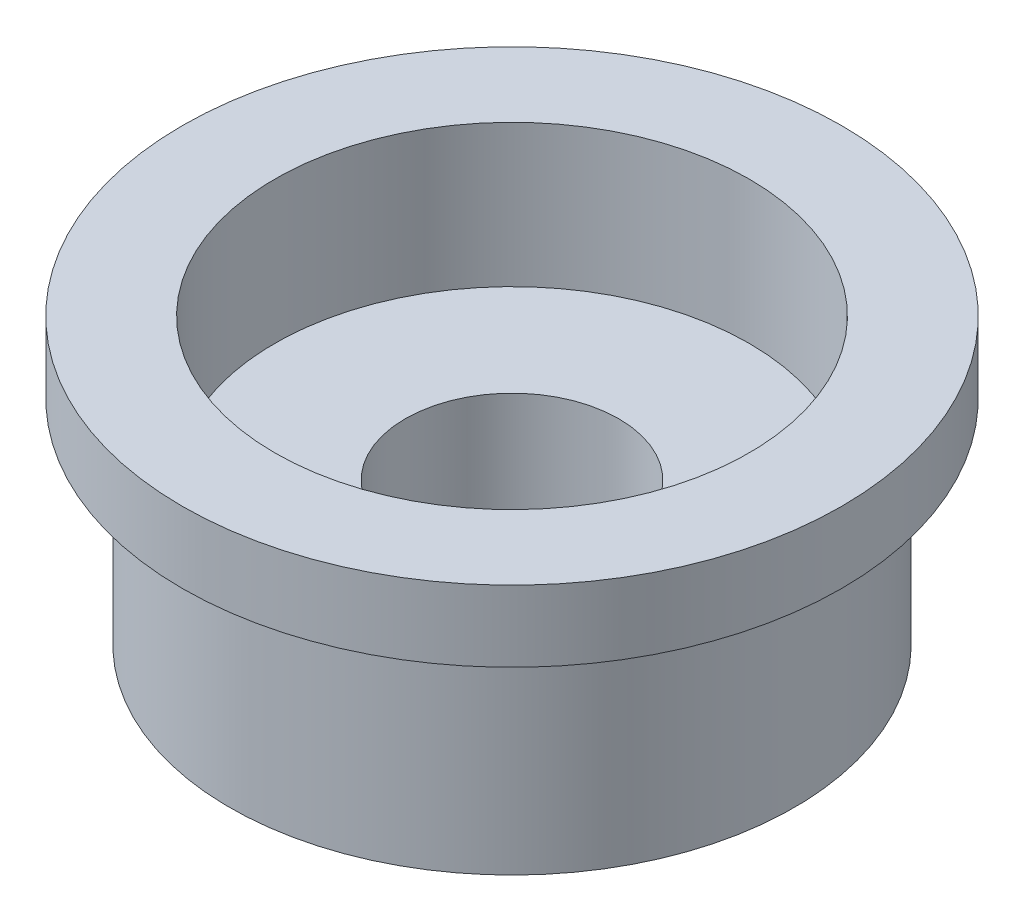
ISO-10303-21;
HEADER;
FILE_DESCRIPTION(('STEP AP214'),'2;1');
FILE_NAME('part.step','',(''),(''),'','','');
FILE_SCHEMA(('AUTOMOTIVE_DESIGN { 1 0 10303 214 1 1 1 1 }'));
ENDSEC;
DATA;
#1=APPLICATION_CONTEXT('core data for automotive mechanical design processes');
#2=APPLICATION_PROTOCOL_DEFINITION('international standard','automotive_design',2000,#1);
#3=PRODUCT_CONTEXT('',#1,'mechanical');
#4=PRODUCT('Part','Part','',(#3));
#5=PRODUCT_RELATED_PRODUCT_CATEGORY('part','',(#4));
#6=PRODUCT_DEFINITION_FORMATION('','',#4);
#7=PRODUCT_DEFINITION_CONTEXT('part definition',#1,'design');
#8=PRODUCT_DEFINITION('design','',#6,#7);
#9=PRODUCT_DEFINITION_SHAPE('','',#8);
#10=(LENGTH_UNIT() NAMED_UNIT(*) SI_UNIT(.MILLI.,.METRE.));
#11=(NAMED_UNIT(*) PLANE_ANGLE_UNIT() SI_UNIT($,.RADIAN.));
#12=(NAMED_UNIT(*) SI_UNIT($,.STERADIAN.) SOLID_ANGLE_UNIT());
#13=UNCERTAINTY_MEASURE_WITH_UNIT(LENGTH_MEASURE(1.E-05),#10,'distance_accuracy_value','');
#14=(GEOMETRIC_REPRESENTATION_CONTEXT(3) GLOBAL_UNCERTAINTY_ASSIGNED_CONTEXT((#13)) GLOBAL_UNIT_ASSIGNED_CONTEXT((#10,
#11,#12)) REPRESENTATION_CONTEXT('',''));
#15=CARTESIAN_POINT('',(0.,0.,0.));
#16=DIRECTION('',(0.,0.,1.));
#17=DIRECTION('',(1.,0.,0.));
#18=AXIS2_PLACEMENT_3D('',#15,#16,#17);
#19=CARTESIAN_POINT('',(0.,26.,0.));
#20=DIRECTION('',(0.,1.,0.));
#21=DIRECTION('',(-1.,0.,0.));
#22=AXIS2_PLACEMENT_3D('',#19,#20,#21);
#23=CYLINDRICAL_SURFACE('',#22,6.95);
#24=CARTESIAN_POINT('',(0.,26.,0.));
#25=DIRECTION('',(0.,1.,0.));
#26=DIRECTION('',(-1.,0.,0.));
#27=AXIS2_PLACEMENT_3D('',#24,#25,#26);
#28=CIRCLE('',#27,6.95);
#29=CARTESIAN_POINT('',(-6.95,26.,0.));
#30=VERTEX_POINT('',#29);
#31=EDGE_CURVE('E19',#30,#30,#28,.T.);
#32=ORIENTED_EDGE('',*,*,#31,.T.);
#33=EDGE_LOOP('',(#32));
#34=FACE_BOUND('',#33,.T.);
#35=CARTESIAN_POINT('',(0.,27.5,0.));
#36=DIRECTION('',(0.,1.,0.));
#37=DIRECTION('',(-1.,0.,0.));
#38=AXIS2_PLACEMENT_3D('',#35,#36,#37);
#39=CIRCLE('',#38,6.95);
#40=CARTESIAN_POINT('',(-6.95,27.5,0.));
#41=VERTEX_POINT('',#40);
#42=EDGE_CURVE('E41',#41,#41,#39,.F.);
#43=ORIENTED_EDGE('',*,*,#42,.T.);
#44=EDGE_LOOP('',(#43));
#45=FACE_BOUND('',#44,.T.);
#46=ADVANCED_FACE('F15',(#34,#45),#23,.T.);
#47=CARTESIAN_POINT('',(-7.228,26.,-7.228));
#48=DIRECTION('',(0.,1.,0.));
#49=DIRECTION('',(0.,0.,1.));
#50=AXIS2_PLACEMENT_3D('',#47,#48,#49);
#51=PLANE('',#50);
#52=CARTESIAN_POINT('',(0.,26.,0.));
#53=DIRECTION('',(0.,1.,0.));
#54=DIRECTION('',(-1.,0.,0.));
#55=AXIS2_PLACEMENT_3D('',#52,#53,#54);
#56=CIRCLE('',#55,5.95);
#57=CARTESIAN_POINT('',(-5.95,26.,0.));
#58=VERTEX_POINT('',#57);
#59=EDGE_CURVE('E39',#58,#58,#56,.T.);
#60=ORIENTED_EDGE('',*,*,#59,.T.);
#61=EDGE_LOOP('',(#60));
#62=FACE_BOUND('',#61,.T.);
#63=ORIENTED_EDGE('',*,*,#31,.F.);
#64=EDGE_LOOP('',(#63));
#65=FACE_BOUND('',#64,.T.);
#66=ADVANCED_FACE('F49',(#62,#65),#51,.F.);
#67=CARTESIAN_POINT('',(-7.228,27.5,-7.228));
#68=DIRECTION('',(0.,1.,0.));
#69=DIRECTION('',(0.,0.,1.));
#70=AXIS2_PLACEMENT_3D('',#67,#68,#69);
#71=PLANE('',#70);
#72=CARTESIAN_POINT('',(0.,27.5,0.));
#73=DIRECTION('',(0.,1.,0.));
#74=DIRECTION('',(0.,0.,1.));
#75=AXIS2_PLACEMENT_3D('',#72,#73,#74);
#76=CIRCLE('',#75,5.);
#77=CARTESIAN_POINT('',(0.,27.5,5.));
#78=VERTEX_POINT('',#77);
#79=EDGE_CURVE('E36',#78,#78,#76,.F.);
#80=ORIENTED_EDGE('',*,*,#79,.T.);
#81=EDGE_LOOP('',(#80));
#82=FACE_BOUND('',#81,.T.);
#83=ORIENTED_EDGE('',*,*,#42,.F.);
#84=EDGE_LOOP('',(#83));
#85=FACE_BOUND('',#84,.T.);
#86=ADVANCED_FACE('F51',(#82,#85),#71,.T.);
#87=CARTESIAN_POINT('',(0.,21.5,0.));
#88=DIRECTION('',(0.,1.,0.));
#89=DIRECTION('',(-1.,0.,0.));
#90=AXIS2_PLACEMENT_3D('',#87,#88,#89);
#91=CYLINDRICAL_SURFACE('',#90,5.95);
#92=ORIENTED_EDGE('',*,*,#59,.F.);
#93=EDGE_LOOP('',(#92));
#94=FACE_BOUND('',#93,.T.);
#95=CARTESIAN_POINT('',(0.,21.5,0.));
#96=DIRECTION('',(0.,1.,0.));
#97=DIRECTION('',(-1.,0.,0.));
#98=AXIS2_PLACEMENT_3D('',#95,#96,#97);
#99=CIRCLE('',#98,5.95);
#100=CARTESIAN_POINT('',(-5.95,21.5,0.));
#101=VERTEX_POINT('',#100);
#102=EDGE_CURVE('E33',#101,#101,#99,.T.);
#103=ORIENTED_EDGE('',*,*,#102,.T.);
#104=EDGE_LOOP('',(#103));
#105=FACE_BOUND('',#104,.T.);
#106=ADVANCED_FACE('F59',(#94,#105),#91,.T.);
#107=CARTESIAN_POINT('',(0.,24.5,0.));
#108=DIRECTION('',(0.,1.,0.));
#109=DIRECTION('',(0.,0.,1.));
#110=AXIS2_PLACEMENT_3D('',#107,#108,#109);
#111=CYLINDRICAL_SURFACE('',#110,5.);
#112=ORIENTED_EDGE('',*,*,#79,.F.);
#113=EDGE_LOOP('',(#112));
#114=FACE_BOUND('',#113,.T.);
#115=CARTESIAN_POINT('',(0.,24.5,0.));
#116=DIRECTION('',(0.,1.,0.));
#117=DIRECTION('',(0.,0.,1.));
#118=AXIS2_PLACEMENT_3D('',#115,#116,#117);
#119=CIRCLE('',#118,5.);
#120=CARTESIAN_POINT('',(0.,24.5,5.));
#121=VERTEX_POINT('',#120);
#122=EDGE_CURVE('E28',#121,#121,#119,.F.);
#123=ORIENTED_EDGE('',*,*,#122,.T.);
#124=EDGE_LOOP('',(#123));
#125=FACE_BOUND('',#124,.T.);
#126=ADVANCED_FACE('F74',(#114,#125),#111,.F.);
#127=CARTESIAN_POINT('',(-6.188,21.5,-6.188));
#128=DIRECTION('',(0.,1.,0.));
#129=DIRECTION('',(0.,0.,1.));
#130=AXIS2_PLACEMENT_3D('',#127,#128,#129);
#131=PLANE('',#130);
#132=CARTESIAN_POINT('',(0.,21.5,0.));
#133=DIRECTION('',(0.,1.,0.));
#134=DIRECTION('',(-1.,0.,0.));
#135=AXIS2_PLACEMENT_3D('',#132,#133,#134);
#136=CIRCLE('',#135,2.25);
#137=CARTESIAN_POINT('',(-2.25,21.5,0.));
#138=VERTEX_POINT('',#137);
#139=EDGE_CURVE('E23',#138,#138,#136,.T.);
#140=ORIENTED_EDGE('',*,*,#139,.T.);
#141=EDGE_LOOP('',(#140));
#142=FACE_BOUND('',#141,.T.);
#143=ORIENTED_EDGE('',*,*,#102,.F.);
#144=EDGE_LOOP('',(#143));
#145=FACE_BOUND('',#144,.T.);
#146=ADVANCED_FACE('F70',(#142,#145),#131,.F.);
#147=CARTESIAN_POINT('',(-5.2,24.5,-5.2));
#148=DIRECTION('',(0.,1.,0.));
#149=DIRECTION('',(0.,0.,1.));
#150=AXIS2_PLACEMENT_3D('',#147,#148,#149);
#151=PLANE('',#150);
#152=CARTESIAN_POINT('',(0.,24.5,0.));
#153=DIRECTION('',(0.,1.,0.));
#154=DIRECTION('',(-1.,0.,0.));
#155=AXIS2_PLACEMENT_3D('',#152,#153,#154);
#156=CIRCLE('',#155,2.25);
#157=CARTESIAN_POINT('',(-2.25,24.5,0.));
#158=VERTEX_POINT('',#157);
#159=EDGE_CURVE('E10',#158,#158,#156,.F.);
#160=ORIENTED_EDGE('',*,*,#159,.T.);
#161=EDGE_LOOP('',(#160));
#162=FACE_BOUND('',#161,.T.);
#163=ORIENTED_EDGE('',*,*,#122,.F.);
#164=EDGE_LOOP('',(#163));
#165=FACE_BOUND('',#164,.T.);
#166=ADVANCED_FACE('F17',(#162,#165),#151,.T.);
#167=CARTESIAN_POINT('',(0.,21.5,0.));
#168=DIRECTION('',(0.,1.,0.));
#169=DIRECTION('',(-1.,0.,0.));
#170=AXIS2_PLACEMENT_3D('',#167,#168,#169);
#171=CYLINDRICAL_SURFACE('',#170,2.25);
#172=ORIENTED_EDGE('',*,*,#139,.F.);
#173=EDGE_LOOP('',(#172));
#174=FACE_BOUND('',#173,.T.);
#175=ORIENTED_EDGE('',*,*,#159,.F.);
#176=EDGE_LOOP('',(#175));
#177=FACE_BOUND('',#176,.T.);
#178=ADVANCED_FACE('F63',(#174,#177),#171,.F.);
#179=CLOSED_SHELL('',(#46,#66,#86,#106,#126,#146,#166,#178));
#180=MANIFOLD_SOLID_BREP('B1',#179);
#181=ADVANCED_BREP_SHAPE_REPRESENTATION('',(#18,#180),#14);
#182=SHAPE_DEFINITION_REPRESENTATION(#9,#181);
ENDSEC;
END-ISO-10303-21;
